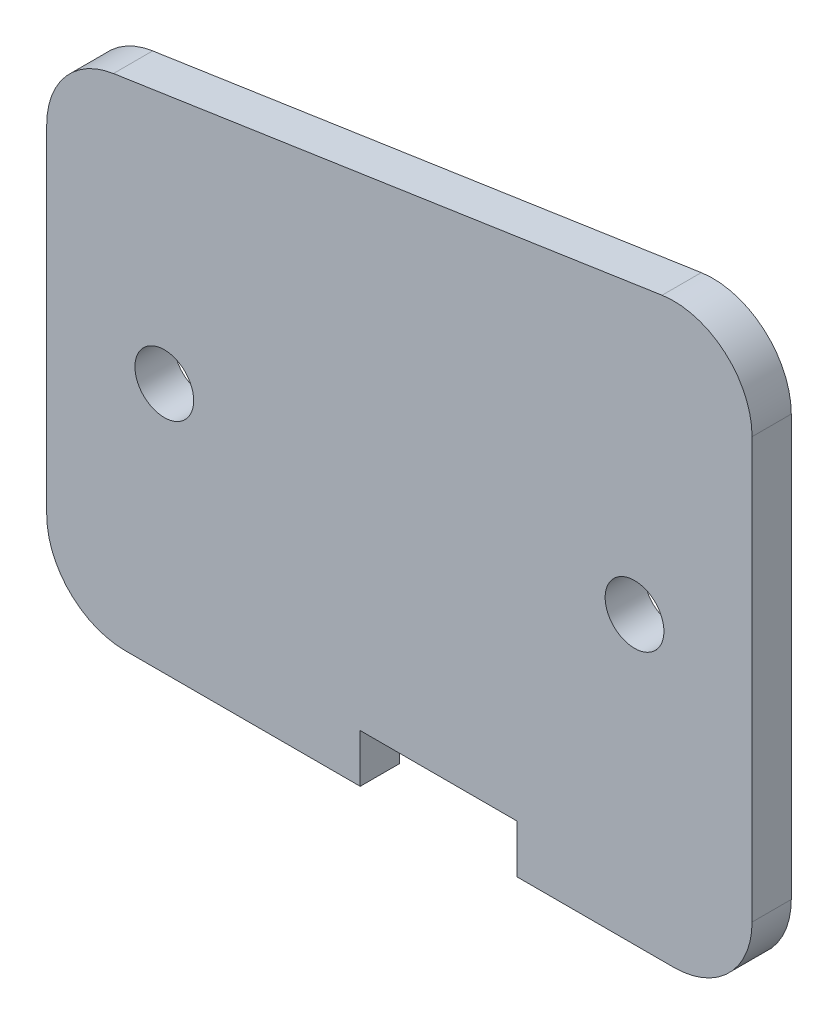
ISO-10303-21;
HEADER;
FILE_DESCRIPTION(('STEP AP214'),'2;1');
FILE_NAME('part.step','',(''),(''),'','','');
FILE_SCHEMA(('AUTOMOTIVE_DESIGN { 1 0 10303 214 1 1 1 1 }'));
ENDSEC;
DATA;
#1=APPLICATION_CONTEXT('core data for automotive mechanical design processes');
#2=APPLICATION_PROTOCOL_DEFINITION('international standard','automotive_design',2000,#1);
#3=PRODUCT_CONTEXT('',#1,'mechanical');
#4=PRODUCT('Part','Part','',(#3));
#5=PRODUCT_RELATED_PRODUCT_CATEGORY('part','',(#4));
#6=PRODUCT_DEFINITION_FORMATION('','',#4);
#7=PRODUCT_DEFINITION_CONTEXT('part definition',#1,'design');
#8=PRODUCT_DEFINITION('design','',#6,#7);
#9=PRODUCT_DEFINITION_SHAPE('','',#8);
#10=(LENGTH_UNIT() NAMED_UNIT(*) SI_UNIT(.MILLI.,.METRE.));
#11=(NAMED_UNIT(*) PLANE_ANGLE_UNIT() SI_UNIT($,.RADIAN.));
#12=(NAMED_UNIT(*) SI_UNIT($,.STERADIAN.) SOLID_ANGLE_UNIT());
#13=UNCERTAINTY_MEASURE_WITH_UNIT(LENGTH_MEASURE(1.E-05),#10,'distance_accuracy_value','');
#14=(GEOMETRIC_REPRESENTATION_CONTEXT(3) GLOBAL_UNCERTAINTY_ASSIGNED_CONTEXT((#13)) GLOBAL_UNIT_ASSIGNED_CONTEXT((#10,
#11,#12)) REPRESENTATION_CONTEXT('',''));
#15=CARTESIAN_POINT('',(0.,0.,0.));
#16=DIRECTION('',(0.,0.,1.));
#17=DIRECTION('',(1.,0.,0.));
#18=AXIS2_PLACEMENT_3D('',#15,#16,#17);
#19=CARTESIAN_POINT('',(-111.125,40.4102098778702,3.175));
#20=DIRECTION('',(0.,0.,-1.));
#21=DIRECTION('',(-1.,0.,0.));
#22=AXIS2_PLACEMENT_3D('',#19,#20,#21);
#23=CYLINDRICAL_SURFACE('',#22,6.35);
#24=CARTESIAN_POINT('',(-111.125,40.4102098778702,0.));
#25=DIRECTION('',(0.,0.,1.));
#26=DIRECTION('',(1.,0.,0.));
#27=AXIS2_PLACEMENT_3D('',#24,#25,#26);
#28=CIRCLE('',#27,6.35);
#29=CARTESIAN_POINT('',(-104.775,40.4102098778702,0.));
#30=VERTEX_POINT('',#29);
#31=CARTESIAN_POINT('',(-112.066961876107,46.6899557185839,0.));
#32=VERTEX_POINT('',#31);
#33=EDGE_CURVE('E160',#30,#32,#28,.T.);
#34=ORIENTED_EDGE('',*,*,#33,.T.);
#35=DIRECTION('',(0.,0.,-1.));
#36=VECTOR('',#35,1.);
#37=CARTESIAN_POINT('',(-112.066961876107,46.6899557185839,3.175));
#38=LINE('',#37,#36);
#39=CARTESIAN_POINT('',(-112.066961876107,46.6899557185839,3.175));
#40=VERTEX_POINT('',#39);
#41=EDGE_CURVE('E11',#40,#32,#38,.T.);
#42=ORIENTED_EDGE('',*,*,#41,.F.);
#43=CARTESIAN_POINT('',(-111.125,40.4102098778702,3.175));
#44=DIRECTION('',(0.,0.,1.));
#45=DIRECTION('',(1.,0.,0.));
#46=AXIS2_PLACEMENT_3D('',#43,#44,#45);
#47=CIRCLE('',#46,6.35);
#48=CARTESIAN_POINT('',(-104.775,40.4102098778702,3.175));
#49=VERTEX_POINT('',#48);
#50=EDGE_CURVE('E100',#49,#40,#47,.T.);
#51=ORIENTED_EDGE('',*,*,#50,.F.);
#52=DIRECTION('',(0.,0.,-1.));
#53=VECTOR('',#52,1.);
#54=CARTESIAN_POINT('',(-104.775,40.4102098778702,3.175));
#55=LINE('',#54,#53);
#56=EDGE_CURVE('E51',#49,#30,#55,.T.);
#57=ORIENTED_EDGE('',*,*,#56,.T.);
#58=EDGE_LOOP('',(#34,#42,#51,#57));
#59=FACE_BOUND('',#58,.T.);
#60=ADVANCED_FACE('F35',(#59),#23,.T.);
#61=CARTESIAN_POINT('',(-9.31540342298289,62.1026894865526,3.175));
#62=DIRECTION('',(-0.148340452930245,0.988936352868297,0.));
#63=DIRECTION('',(-0.988936352868298,-0.148340452930245,0.));
#64=AXIS2_PLACEMENT_3D('',#61,#62,#63);
#65=PLANE('',#64);
#66=DIRECTION('',(0.988936352868298,0.148340452930245,0.));
#67=VECTOR('',#66,1.);
#68=CARTESIAN_POINT('',(-9.31540342298289,62.1026894865526,0.));
#69=LINE('',#68,#67);
#70=CARTESIAN_POINT('',(-156.516961876107,40.0224557185839,0.));
#71=VERTEX_POINT('',#70);
#72=EDGE_CURVE('E162',#71,#32,#69,.T.);
#73=ORIENTED_EDGE('',*,*,#72,.F.);
#74=DIRECTION('',(0.,0.,-1.));
#75=VECTOR('',#74,1.);
#76=CARTESIAN_POINT('',(-156.516961876107,40.0224557185839,3.175));
#77=LINE('',#76,#75);
#78=CARTESIAN_POINT('',(-156.516961876107,40.0224557185839,3.175));
#79=VERTEX_POINT('',#78);
#80=EDGE_CURVE('E43',#79,#71,#77,.T.);
#81=ORIENTED_EDGE('',*,*,#80,.F.);
#82=DIRECTION('',(0.988936352868298,0.148340452930245,0.));
#83=VECTOR('',#82,1.);
#84=CARTESIAN_POINT('',(-9.31540342298289,62.1026894865526,3.175));
#85=LINE('',#84,#83);
#86=EDGE_CURVE('E233',#79,#40,#85,.T.);
#87=ORIENTED_EDGE('',*,*,#86,.T.);
#88=ORIENTED_EDGE('',*,*,#41,.T.);
#89=EDGE_LOOP('',(#73,#81,#87,#88));
#90=FACE_BOUND('',#89,.T.);
#91=ADVANCED_FACE('F221',(#90),#65,.T.);
#92=CARTESIAN_POINT('',(-155.575,33.7427098778702,3.175));
#93=DIRECTION('',(0.,0.,-1.));
#94=DIRECTION('',(-1.,0.,0.));
#95=AXIS2_PLACEMENT_3D('',#92,#93,#94);
#96=CYLINDRICAL_SURFACE('',#95,6.35);
#97=CARTESIAN_POINT('',(-155.575,33.7427098778702,0.));
#98=DIRECTION('',(0.,0.,1.));
#99=DIRECTION('',(1.,0.,0.));
#100=AXIS2_PLACEMENT_3D('',#97,#98,#99);
#101=CIRCLE('',#100,6.35);
#102=CARTESIAN_POINT('',(-161.925,33.7427098778702,0.));
#103=VERTEX_POINT('',#102);
#104=EDGE_CURVE('E165',#103,#71,#101,.F.);
#105=ORIENTED_EDGE('',*,*,#104,.F.);
#106=DIRECTION('',(0.,0.,-1.));
#107=VECTOR('',#106,1.);
#108=CARTESIAN_POINT('',(-161.925,33.7427098778702,3.175));
#109=LINE('',#108,#107);
#110=CARTESIAN_POINT('',(-161.925,33.7427098778702,3.175));
#111=VERTEX_POINT('',#110);
#112=EDGE_CURVE('E211',#111,#103,#109,.T.);
#113=ORIENTED_EDGE('',*,*,#112,.F.);
#114=CARTESIAN_POINT('',(-155.575,33.7427098778702,3.175));
#115=DIRECTION('',(0.,0.,1.));
#116=DIRECTION('',(1.,0.,0.));
#117=AXIS2_PLACEMENT_3D('',#114,#115,#116);
#118=CIRCLE('',#117,6.35);
#119=EDGE_CURVE('E218',#111,#79,#118,.F.);
#120=ORIENTED_EDGE('',*,*,#119,.T.);
#121=ORIENTED_EDGE('',*,*,#80,.T.);
#122=EDGE_LOOP('',(#105,#113,#120,#121));
#123=FACE_BOUND('',#122,.T.);
#124=ADVANCED_FACE('F216',(#123),#96,.T.);
#125=CARTESIAN_POINT('',(-161.925,0.,3.175));
#126=DIRECTION('',(-1.,0.,0.));
#127=DIRECTION('',(0.,0.,1.));
#128=AXIS2_PLACEMENT_3D('',#125,#126,#127);
#129=PLANE('',#128);
#130=DIRECTION('',(0.,1.,0.));
#131=VECTOR('',#130,1.);
#132=CARTESIAN_POINT('',(-161.925,0.,0.));
#133=LINE('',#132,#131);
#134=CARTESIAN_POINT('',(-161.925,6.35000000000002,0.));
#135=VERTEX_POINT('',#134);
#136=EDGE_CURVE('E168',#135,#103,#133,.T.);
#137=ORIENTED_EDGE('',*,*,#136,.F.);
#138=DIRECTION('',(0.,0.,-1.));
#139=VECTOR('',#138,1.);
#140=CARTESIAN_POINT('',(-161.925,6.35000000000002,3.175));
#141=LINE('',#140,#139);
#142=CARTESIAN_POINT('',(-161.925,6.35000000000002,3.175));
#143=VERTEX_POINT('',#142);
#144=EDGE_CURVE('E209',#143,#135,#141,.T.);
#145=ORIENTED_EDGE('',*,*,#144,.F.);
#146=DIRECTION('',(0.,1.,0.));
#147=VECTOR('',#146,1.);
#148=CARTESIAN_POINT('',(-161.925,0.,3.175));
#149=LINE('',#148,#147);
#150=EDGE_CURVE('E232',#143,#111,#149,.T.);
#151=ORIENTED_EDGE('',*,*,#150,.T.);
#152=ORIENTED_EDGE('',*,*,#112,.T.);
#153=EDGE_LOOP('',(#137,#145,#151,#152));
#154=FACE_BOUND('',#153,.T.);
#155=ADVANCED_FACE('F228',(#154),#129,.T.);
#156=CARTESIAN_POINT('',(-155.575,6.34999999999998,3.175));
#157=DIRECTION('',(0.,0.,-1.));
#158=DIRECTION('',(-1.,0.,0.));
#159=AXIS2_PLACEMENT_3D('',#156,#157,#158);
#160=CYLINDRICAL_SURFACE('',#159,6.35);
#161=CARTESIAN_POINT('',(-155.575,6.34999999999998,0.));
#162=DIRECTION('',(0.,0.,1.));
#163=DIRECTION('',(1.,0.,0.));
#164=AXIS2_PLACEMENT_3D('',#161,#162,#163);
#165=CIRCLE('',#164,6.35);
#166=CARTESIAN_POINT('',(-155.575,0.,0.));
#167=VERTEX_POINT('',#166);
#168=EDGE_CURVE('E171',#135,#167,#165,.T.);
#169=ORIENTED_EDGE('',*,*,#168,.T.);
#170=DIRECTION('',(0.,0.,-1.));
#171=VECTOR('',#170,1.);
#172=CARTESIAN_POINT('',(-155.575,0.,3.175));
#173=LINE('',#172,#171);
#174=CARTESIAN_POINT('',(-155.575,0.,3.175));
#175=VERTEX_POINT('',#174);
#176=EDGE_CURVE('E207',#175,#167,#173,.T.);
#177=ORIENTED_EDGE('',*,*,#176,.F.);
#178=CARTESIAN_POINT('',(-155.575,6.34999999999998,3.175));
#179=DIRECTION('',(0.,0.,1.));
#180=DIRECTION('',(1.,0.,0.));
#181=AXIS2_PLACEMENT_3D('',#178,#179,#180);
#182=CIRCLE('',#181,6.35);
#183=EDGE_CURVE('E235',#143,#175,#182,.T.);
#184=ORIENTED_EDGE('',*,*,#183,.F.);
#185=ORIENTED_EDGE('',*,*,#144,.T.);
#186=EDGE_LOOP('',(#169,#177,#184,#185));
#187=FACE_BOUND('',#186,.T.);
#188=ADVANCED_FACE('F277',(#187),#160,.T.);
#189=CARTESIAN_POINT('',(0.,0.,3.175));
#190=DIRECTION('',(0.,-1.,0.));
#191=DIRECTION('',(1.,0.,0.));
#192=AXIS2_PLACEMENT_3D('',#189,#190,#191);
#193=PLANE('',#192);
#194=DIRECTION('',(-1.,0.,0.));
#195=VECTOR('',#194,1.);
#196=CARTESIAN_POINT('',(0.,0.,0.));
#197=LINE('',#196,#195);
#198=CARTESIAN_POINT('',(-136.525,0.,0.));
#199=VERTEX_POINT('',#198);
#200=EDGE_CURVE('E174',#199,#167,#197,.T.);
#201=ORIENTED_EDGE('',*,*,#200,.F.);
#202=DIRECTION('',(0.,0.,-1.));
#203=VECTOR('',#202,1.);
#204=CARTESIAN_POINT('',(-136.525,0.,3.175));
#205=LINE('',#204,#203);
#206=CARTESIAN_POINT('',(-136.525,0.,3.175));
#207=VERTEX_POINT('',#206);
#208=EDGE_CURVE('E205',#207,#199,#205,.T.);
#209=ORIENTED_EDGE('',*,*,#208,.F.);
#210=DIRECTION('',(-1.,0.,0.));
#211=VECTOR('',#210,1.);
#212=CARTESIAN_POINT('',(0.,0.,3.175));
#213=LINE('',#212,#211);
#214=EDGE_CURVE('E241',#207,#175,#213,.T.);
#215=ORIENTED_EDGE('',*,*,#214,.T.);
#216=ORIENTED_EDGE('',*,*,#176,.T.);
#217=EDGE_LOOP('',(#201,#209,#215,#216));
#218=FACE_BOUND('',#217,.T.);
#219=ADVANCED_FACE('F280',(#218),#193,.T.);
#220=CARTESIAN_POINT('',(-136.525,0.,3.175));
#221=DIRECTION('',(-1.,0.,0.));
#222=DIRECTION('',(0.,0.,1.));
#223=AXIS2_PLACEMENT_3D('',#220,#221,#222);
#224=PLANE('',#223);
#225=DIRECTION('',(0.,1.,0.));
#226=VECTOR('',#225,1.);
#227=CARTESIAN_POINT('',(-136.525,0.,0.));
#228=LINE('',#227,#226);
#229=CARTESIAN_POINT('',(-136.525,3.915859714578,0.));
#230=VERTEX_POINT('',#229);
#231=EDGE_CURVE('E177',#199,#230,#228,.T.);
#232=ORIENTED_EDGE('',*,*,#231,.T.);
#233=DIRECTION('',(0.,0.,-1.));
#234=VECTOR('',#233,1.);
#235=CARTESIAN_POINT('',(-136.525,3.915859714578,3.175));
#236=LINE('',#235,#234);
#237=CARTESIAN_POINT('',(-136.525,3.915859714578,3.175));
#238=VERTEX_POINT('',#237);
#239=EDGE_CURVE('E202',#238,#230,#236,.T.);
#240=ORIENTED_EDGE('',*,*,#239,.F.);
#241=DIRECTION('',(0.,1.,0.));
#242=VECTOR('',#241,1.);
#243=CARTESIAN_POINT('',(-136.525,0.,3.175));
#244=LINE('',#243,#242);
#245=EDGE_CURVE('E244',#207,#238,#244,.T.);
#246=ORIENTED_EDGE('',*,*,#245,.F.);
#247=ORIENTED_EDGE('',*,*,#208,.T.);
#248=EDGE_LOOP('',(#232,#240,#246,#247));
#249=FACE_BOUND('',#248,.T.);
#250=ADVANCED_FACE('F284',(#249),#224,.F.);
#251=CARTESIAN_POINT('',(0.,3.91585971457801,3.175));
#252=DIRECTION('',(0.,1.,0.));
#253=DIRECTION('',(-1.,0.,0.));
#254=AXIS2_PLACEMENT_3D('',#251,#252,#253);
#255=PLANE('',#254);
#256=DIRECTION('',(1.,0.,0.));
#257=VECTOR('',#256,1.);
#258=CARTESIAN_POINT('',(0.,3.91585971457801,0.));
#259=LINE('',#258,#257);
#260=CARTESIAN_POINT('',(-123.825,3.915859714578,0.));
#261=VERTEX_POINT('',#260);
#262=EDGE_CURVE('E179',#230,#261,#259,.T.);
#263=ORIENTED_EDGE('',*,*,#262,.T.);
#264=DIRECTION('',(0.,0.,-1.));
#265=VECTOR('',#264,1.);
#266=CARTESIAN_POINT('',(-123.825,3.915859714578,3.175));
#267=LINE('',#266,#265);
#268=CARTESIAN_POINT('',(-123.825,3.915859714578,3.175));
#269=VERTEX_POINT('',#268);
#270=EDGE_CURVE('E200',#269,#261,#267,.T.);
#271=ORIENTED_EDGE('',*,*,#270,.F.);
#272=DIRECTION('',(1.,0.,0.));
#273=VECTOR('',#272,1.);
#274=CARTESIAN_POINT('',(0.,3.91585971457801,3.175));
#275=LINE('',#274,#273);
#276=EDGE_CURVE('E246',#238,#269,#275,.T.);
#277=ORIENTED_EDGE('',*,*,#276,.F.);
#278=ORIENTED_EDGE('',*,*,#239,.T.);
#279=EDGE_LOOP('',(#263,#271,#277,#278));
#280=FACE_BOUND('',#279,.T.);
#281=ADVANCED_FACE('F288',(#280),#255,.F.);
#282=CARTESIAN_POINT('',(-123.825,0.,3.175));
#283=DIRECTION('',(-1.,0.,0.));
#284=DIRECTION('',(0.,0.,1.));
#285=AXIS2_PLACEMENT_3D('',#282,#283,#284);
#286=PLANE('',#285);
#287=DIRECTION('',(0.,1.,0.));
#288=VECTOR('',#287,1.);
#289=CARTESIAN_POINT('',(-123.825,0.,0.));
#290=LINE('',#289,#288);
#291=CARTESIAN_POINT('',(-123.825,0.,0.));
#292=VERTEX_POINT('',#291);
#293=EDGE_CURVE('E182',#292,#261,#290,.T.);
#294=ORIENTED_EDGE('',*,*,#293,.F.);
#295=DIRECTION('',(0.,0.,-1.));
#296=VECTOR('',#295,1.);
#297=CARTESIAN_POINT('',(-123.825,0.,3.175));
#298=LINE('',#297,#296);
#299=CARTESIAN_POINT('',(-123.825,0.,3.175));
#300=VERTEX_POINT('',#299);
#301=EDGE_CURVE('E138',#300,#292,#298,.T.);
#302=ORIENTED_EDGE('',*,*,#301,.F.);
#303=DIRECTION('',(0.,1.,0.));
#304=VECTOR('',#303,1.);
#305=CARTESIAN_POINT('',(-123.825,0.,3.175));
#306=LINE('',#305,#304);
#307=EDGE_CURVE('E146',#300,#269,#306,.T.);
#308=ORIENTED_EDGE('',*,*,#307,.T.);
#309=ORIENTED_EDGE('',*,*,#270,.T.);
#310=EDGE_LOOP('',(#294,#302,#308,#309));
#311=FACE_BOUND('',#310,.T.);
#312=ADVANCED_FACE('F249',(#311),#286,.T.);
#313=CARTESIAN_POINT('',(0.,0.,3.175));
#314=DIRECTION('',(0.,-1.,0.));
#315=DIRECTION('',(1.,0.,0.));
#316=AXIS2_PLACEMENT_3D('',#313,#314,#315);
#317=PLANE('',#316);
#318=DIRECTION('',(-1.,0.,0.));
#319=VECTOR('',#318,1.);
#320=CARTESIAN_POINT('',(0.,0.,0.));
#321=LINE('',#320,#319);
#322=CARTESIAN_POINT('',(-111.125,0.,0.));
#323=VERTEX_POINT('',#322);
#324=EDGE_CURVE('E134',#323,#292,#321,.T.);
#325=ORIENTED_EDGE('',*,*,#324,.F.);
#326=DIRECTION('',(0.,0.,-1.));
#327=VECTOR('',#326,1.);
#328=CARTESIAN_POINT('',(-111.125,0.,3.175));
#329=LINE('',#328,#327);
#330=CARTESIAN_POINT('',(-111.125,0.,3.175));
#331=VERTEX_POINT('',#330);
#332=EDGE_CURVE('E129',#331,#323,#329,.T.);
#333=ORIENTED_EDGE('',*,*,#332,.F.);
#334=DIRECTION('',(-1.,0.,0.));
#335=VECTOR('',#334,1.);
#336=CARTESIAN_POINT('',(0.,0.,3.175));
#337=LINE('',#336,#335);
#338=EDGE_CURVE('E132',#331,#300,#337,.T.);
#339=ORIENTED_EDGE('',*,*,#338,.T.);
#340=ORIENTED_EDGE('',*,*,#301,.T.);
#341=EDGE_LOOP('',(#325,#333,#339,#340));
#342=FACE_BOUND('',#341,.T.);
#343=ADVANCED_FACE('F131',(#342),#317,.T.);
#344=CARTESIAN_POINT('',(-111.125,6.34999999999998,3.175));
#345=DIRECTION('',(0.,0.,-1.));
#346=DIRECTION('',(-1.,0.,0.));
#347=AXIS2_PLACEMENT_3D('',#344,#345,#346);
#348=CYLINDRICAL_SURFACE('',#347,6.35);
#349=CARTESIAN_POINT('',(-111.125,6.34999999999998,0.));
#350=DIRECTION('',(0.,0.,1.));
#351=DIRECTION('',(1.,0.,0.));
#352=AXIS2_PLACEMENT_3D('',#349,#350,#351);
#353=CIRCLE('',#352,6.35);
#354=CARTESIAN_POINT('',(-104.775,6.35000000000003,0.));
#355=VERTEX_POINT('',#354);
#356=EDGE_CURVE('E186',#355,#323,#353,.F.);
#357=ORIENTED_EDGE('',*,*,#356,.F.);
#358=DIRECTION('',(0.,0.,-1.));
#359=VECTOR('',#358,1.);
#360=CARTESIAN_POINT('',(-104.775,6.35000000000003,3.175));
#361=LINE('',#360,#359);
#362=CARTESIAN_POINT('',(-104.775,6.35000000000003,3.175));
#363=VERTEX_POINT('',#362);
#364=EDGE_CURVE('E88',#363,#355,#361,.T.);
#365=ORIENTED_EDGE('',*,*,#364,.F.);
#366=CARTESIAN_POINT('',(-111.125,6.34999999999998,3.175));
#367=DIRECTION('',(0.,0.,1.));
#368=DIRECTION('',(1.,0.,0.));
#369=AXIS2_PLACEMENT_3D('',#366,#367,#368);
#370=CIRCLE('',#369,6.35);
#371=EDGE_CURVE('E144',#363,#331,#370,.F.);
#372=ORIENTED_EDGE('',*,*,#371,.T.);
#373=ORIENTED_EDGE('',*,*,#332,.T.);
#374=EDGE_LOOP('',(#357,#365,#372,#373));
#375=FACE_BOUND('',#374,.T.);
#376=ADVANCED_FACE('F148',(#375),#348,.T.);
#377=CARTESIAN_POINT('',(-152.4,20.3199999999996,3.175));
#378=DIRECTION('',(0.,0.,-1.));
#379=DIRECTION('',(-1.,0.,0.));
#380=AXIS2_PLACEMENT_3D('',#377,#378,#379);
#381=CYLINDRICAL_SURFACE('',#380,2.38125000000001);
#382=CARTESIAN_POINT('',(-152.4,20.3199999999996,3.175));
#383=DIRECTION('',(0.,0.,1.));
#384=DIRECTION('',(1.,0.,0.));
#385=AXIS2_PLACEMENT_3D('',#382,#383,#384);
#386=CIRCLE('',#385,2.38125000000001);
#387=CARTESIAN_POINT('',(-150.01875,20.3199999999996,3.175));
#388=VERTEX_POINT('',#387);
#389=EDGE_CURVE('E151',#388,#388,#386,.T.);
#390=ORIENTED_EDGE('',*,*,#389,.T.);
#391=EDGE_LOOP('',(#390));
#392=FACE_BOUND('',#391,.T.);
#393=CARTESIAN_POINT('',(-152.4,20.3199999999996,0.));
#394=DIRECTION('',(0.,0.,1.));
#395=DIRECTION('',(1.,0.,0.));
#396=AXIS2_PLACEMENT_3D('',#393,#394,#395);
#397=CIRCLE('',#396,2.38125000000001);
#398=CARTESIAN_POINT('',(-150.01875,20.3199999999996,0.));
#399=VERTEX_POINT('',#398);
#400=EDGE_CURVE('E191',#399,#399,#397,.T.);
#401=ORIENTED_EDGE('',*,*,#400,.F.);
#402=EDGE_LOOP('',(#401));
#403=FACE_BOUND('',#402,.T.);
#404=ADVANCED_FACE('F255',(#392,#403),#381,.F.);
#405=CARTESIAN_POINT('',(-104.775,0.,3.175));
#406=DIRECTION('',(1.,0.,0.));
#407=DIRECTION('',(0.,0.,-1.));
#408=AXIS2_PLACEMENT_3D('',#405,#406,#407);
#409=PLANE('',#408);
#410=DIRECTION('',(0.,-1.,0.));
#411=VECTOR('',#410,1.);
#412=CARTESIAN_POINT('',(-104.775,0.,0.));
#413=LINE('',#412,#411);
#414=EDGE_CURVE('E188',#30,#355,#413,.T.);
#415=ORIENTED_EDGE('',*,*,#414,.F.);
#416=ORIENTED_EDGE('',*,*,#56,.F.);
#417=DIRECTION('',(0.,-1.,0.));
#418=VECTOR('',#417,1.);
#419=CARTESIAN_POINT('',(-104.775,0.,3.175));
#420=LINE('',#419,#418);
#421=EDGE_CURVE('E149',#49,#363,#420,.T.);
#422=ORIENTED_EDGE('',*,*,#421,.T.);
#423=ORIENTED_EDGE('',*,*,#364,.T.);
#424=EDGE_LOOP('',(#415,#416,#422,#423));
#425=FACE_BOUND('',#424,.T.);
#426=ADVANCED_FACE('F252',(#425),#409,.T.);
#427=CARTESIAN_POINT('',(-114.3,23.1774999999997,3.175));
#428=DIRECTION('',(0.,0.,-1.));
#429=DIRECTION('',(-1.,0.,0.));
#430=AXIS2_PLACEMENT_3D('',#427,#428,#429);
#431=CYLINDRICAL_SURFACE('',#430,2.38125000000001);
#432=CARTESIAN_POINT('',(-114.3,23.1774999999997,3.175));
#433=DIRECTION('',(0.,0.,1.));
#434=DIRECTION('',(1.,0.,0.));
#435=AXIS2_PLACEMENT_3D('',#432,#433,#434);
#436=CIRCLE('',#435,2.38125000000001);
#437=CARTESIAN_POINT('',(-111.91875,23.1774999999997,3.175));
#438=VERTEX_POINT('',#437);
#439=EDGE_CURVE('E157',#438,#438,#436,.T.);
#440=ORIENTED_EDGE('',*,*,#439,.T.);
#441=EDGE_LOOP('',(#440));
#442=FACE_BOUND('',#441,.T.);
#443=CARTESIAN_POINT('',(-114.3,23.1774999999997,0.));
#444=DIRECTION('',(0.,0.,1.));
#445=DIRECTION('',(1.,0.,0.));
#446=AXIS2_PLACEMENT_3D('',#443,#444,#445);
#447=CIRCLE('',#446,2.38125000000001);
#448=CARTESIAN_POINT('',(-111.91875,23.1774999999997,0.));
#449=VERTEX_POINT('',#448);
#450=EDGE_CURVE('E194',#449,#449,#447,.T.);
#451=ORIENTED_EDGE('',*,*,#450,.F.);
#452=EDGE_LOOP('',(#451));
#453=FACE_BOUND('',#452,.T.);
#454=ADVANCED_FACE('F254',(#442,#453),#431,.F.);
#455=CARTESIAN_POINT('',(0.,0.,3.175));
#456=DIRECTION('',(0.,0.,1.));
#457=DIRECTION('',(1.,0.,0.));
#458=AXIS2_PLACEMENT_3D('',#455,#456,#457);
#459=PLANE('',#458);
#460=ORIENTED_EDGE('',*,*,#50,.T.);
#461=ORIENTED_EDGE('',*,*,#86,.F.);
#462=ORIENTED_EDGE('',*,*,#119,.F.);
#463=ORIENTED_EDGE('',*,*,#150,.F.);
#464=ORIENTED_EDGE('',*,*,#183,.T.);
#465=ORIENTED_EDGE('',*,*,#214,.F.);
#466=ORIENTED_EDGE('',*,*,#245,.T.);
#467=ORIENTED_EDGE('',*,*,#276,.T.);
#468=ORIENTED_EDGE('',*,*,#307,.F.);
#469=ORIENTED_EDGE('',*,*,#338,.F.);
#470=ORIENTED_EDGE('',*,*,#371,.F.);
#471=ORIENTED_EDGE('',*,*,#421,.F.);
#472=EDGE_LOOP('',(#460,#461,#462,#463,#464,#465,#466,#467,#468,#469,#470,#471));
#473=FACE_BOUND('',#472,.T.);
#474=ORIENTED_EDGE('',*,*,#389,.F.);
#475=EDGE_LOOP('',(#474));
#476=FACE_BOUND('',#475,.T.);
#477=ORIENTED_EDGE('',*,*,#439,.F.);
#478=EDGE_LOOP('',(#477));
#479=FACE_BOUND('',#478,.T.);
#480=ADVANCED_FACE('F142',(#473,#476,#479),#459,.T.);
#481=CARTESIAN_POINT('',(0.,0.,0.));
#482=DIRECTION('',(0.,0.,1.));
#483=DIRECTION('',(1.,0.,0.));
#484=AXIS2_PLACEMENT_3D('',#481,#482,#483);
#485=PLANE('',#484);
#486=ORIENTED_EDGE('',*,*,#33,.F.);
#487=ORIENTED_EDGE('',*,*,#414,.T.);
#488=ORIENTED_EDGE('',*,*,#356,.T.);
#489=ORIENTED_EDGE('',*,*,#324,.T.);
#490=ORIENTED_EDGE('',*,*,#293,.T.);
#491=ORIENTED_EDGE('',*,*,#262,.F.);
#492=ORIENTED_EDGE('',*,*,#231,.F.);
#493=ORIENTED_EDGE('',*,*,#200,.T.);
#494=ORIENTED_EDGE('',*,*,#168,.F.);
#495=ORIENTED_EDGE('',*,*,#136,.T.);
#496=ORIENTED_EDGE('',*,*,#104,.T.);
#497=ORIENTED_EDGE('',*,*,#72,.T.);
#498=EDGE_LOOP('',(#486,#487,#488,#489,#490,#491,#492,#493,#494,#495,#496,#497));
#499=FACE_BOUND('',#498,.T.);
#500=ORIENTED_EDGE('',*,*,#400,.T.);
#501=EDGE_LOOP('',(#500));
#502=FACE_BOUND('',#501,.T.);
#503=ORIENTED_EDGE('',*,*,#450,.T.);
#504=EDGE_LOOP('',(#503));
#505=FACE_BOUND('',#504,.T.);
#506=ADVANCED_FACE('F223',(#499,#502,#505),#485,.F.);
#507=CLOSED_SHELL('',(#60,#91,#124,#155,#188,#219,#250,#281,#312,#343,#376,#404,#426,#454,#480,#506));
#508=MANIFOLD_SOLID_BREP('B2',#507);
#509=ADVANCED_BREP_SHAPE_REPRESENTATION('',(#18,#508),#14);
#510=SHAPE_DEFINITION_REPRESENTATION(#9,#509);
ENDSEC;
END-ISO-10303-21;
